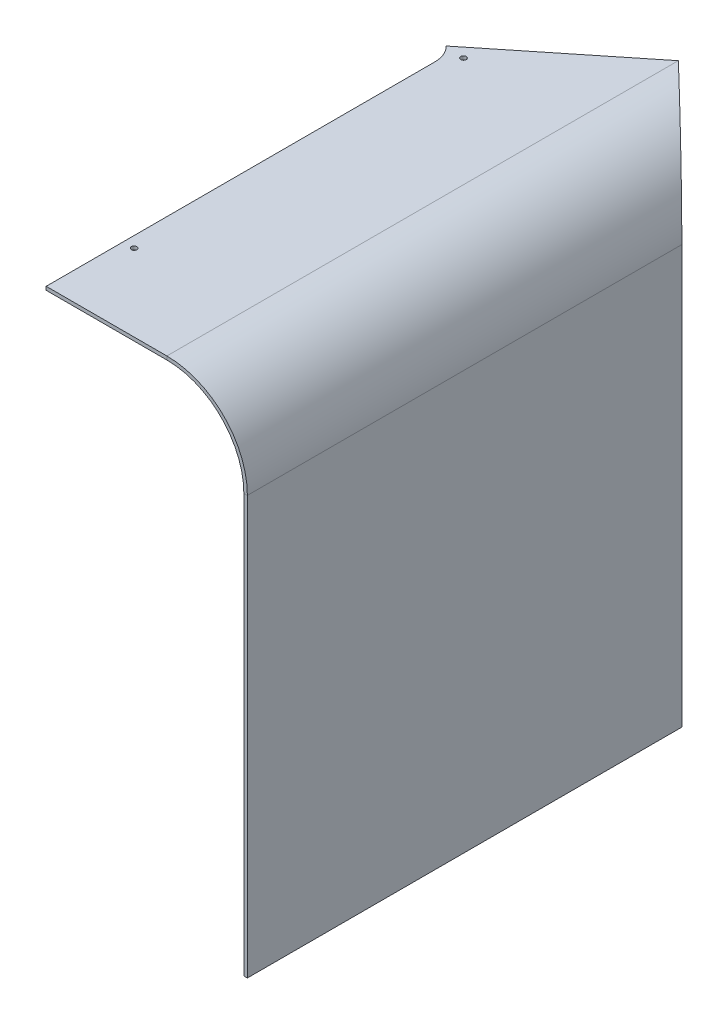
ISO-10303-21;
HEADER;
FILE_DESCRIPTION(('STEP AP214'),'2;1');
FILE_NAME('part.step','',(''),(''),'','','');
FILE_SCHEMA(('AUTOMOTIVE_DESIGN { 1 0 10303 214 1 1 1 1 }'));
ENDSEC;
DATA;
#1=APPLICATION_CONTEXT('core data for automotive mechanical design processes');
#2=APPLICATION_PROTOCOL_DEFINITION('international standard','automotive_design',2000,#1);
#3=PRODUCT_CONTEXT('',#1,'mechanical');
#4=PRODUCT('Part','Part','',(#3));
#5=PRODUCT_RELATED_PRODUCT_CATEGORY('part','',(#4));
#6=PRODUCT_DEFINITION_FORMATION('','',#4);
#7=PRODUCT_DEFINITION_CONTEXT('part definition',#1,'design');
#8=PRODUCT_DEFINITION('design','',#6,#7);
#9=PRODUCT_DEFINITION_SHAPE('','',#8);
#10=(LENGTH_UNIT() NAMED_UNIT(*) SI_UNIT(.MILLI.,.METRE.));
#11=(NAMED_UNIT(*) PLANE_ANGLE_UNIT() SI_UNIT($,.RADIAN.));
#12=(NAMED_UNIT(*) SI_UNIT($,.STERADIAN.) SOLID_ANGLE_UNIT());
#13=UNCERTAINTY_MEASURE_WITH_UNIT(LENGTH_MEASURE(1.E-05),#10,'distance_accuracy_value','');
#14=(GEOMETRIC_REPRESENTATION_CONTEXT(3) GLOBAL_UNCERTAINTY_ASSIGNED_CONTEXT((#13)) GLOBAL_UNIT_ASSIGNED_CONTEXT((#10,
#11,#12)) REPRESENTATION_CONTEXT('',''));
#15=CARTESIAN_POINT('',(0.,0.,0.));
#16=DIRECTION('',(0.,0.,1.));
#17=DIRECTION('',(1.,0.,0.));
#18=AXIS2_PLACEMENT_3D('',#15,#16,#17);
#19=CARTESIAN_POINT('',(255.,-0.01000000000001,-195.));
#20=DIRECTION('',(-0.625854842046578,0.,-0.779939559637061));
#21=DIRECTION('',(-0.779939559637061,0.,0.625854842046578));
#22=AXIS2_PLACEMENT_3D('',#19,#20,#21);
#23=PLANE('',#22);
#24=DIRECTION('',(0.,1.,0.));
#25=VECTOR('',#24,1.);
#26=CARTESIAN_POINT('',(255.,450.,-195.));
#27=LINE('',#26,#25);
#28=CARTESIAN_POINT('',(255.,450.,-195.));
#29=VERTEX_POINT('',#28);
#30=CARTESIAN_POINT('',(255.,453.2,-195.));
#31=VERTEX_POINT('',#30);
#32=EDGE_CURVE('E123',#29,#31,#27,.T.);
#33=ORIENTED_EDGE('',*,*,#32,.F.);
#34=DIRECTION('',(-0.779939559637061,0.,0.625854842046578));
#35=VECTOR('',#34,1.);
#36=CARTESIAN_POINT('',(-245.606205972282,450.,206.706534942418));
#37=LINE('',#36,#35);
#38=CARTESIAN_POINT('',(137.949402277664,450.,-101.073897081128));
#39=VERTEX_POINT('',#38);
#40=EDGE_CURVE('E114',#29,#39,#37,.T.);
#41=ORIENTED_EDGE('',*,*,#40,.T.);
#42=DIRECTION('',(0.,1.,0.));
#43=VECTOR('',#42,1.);
#44=CARTESIAN_POINT('',(137.949402277664,353.2,-101.073897081128));
#45=LINE('',#44,#43);
#46=CARTESIAN_POINT('',(137.949402277664,453.2,-101.073897081128));
#47=VERTEX_POINT('',#46);
#48=EDGE_CURVE('E122',#39,#47,#45,.T.);
#49=ORIENTED_EDGE('',*,*,#48,.T.);
#50=DIRECTION('',(-0.779939559637061,0.,0.625854842046578));
#51=VECTOR('',#50,1.);
#52=CARTESIAN_POINT('',(-245.606205972282,453.2,206.706534942418));
#53=LINE('',#52,#51);
#54=EDGE_CURVE('E124',#31,#47,#53,.T.);
#55=ORIENTED_EDGE('',*,*,#54,.F.);
#56=EDGE_LOOP('',(#33,#41,#49,#55));
#57=FACE_BOUND('',#56,.T.);
#58=ADVANCED_FACE('F39',(#57),#23,.T.);
#59=CARTESIAN_POINT('',(325.,0.,270.));
#60=DIRECTION('',(0.,0.,1.));
#61=DIRECTION('',(0.,-1.,0.));
#62=AXIS2_PLACEMENT_3D('',#59,#60,#61);
#63=PLANE('',#62);
#64=DIRECTION('',(1.,0.,0.));
#65=VECTOR('',#64,1.);
#66=CARTESIAN_POINT('',(325.,380.,269.999999999309));
#67=LINE('',#66,#65);
#68=CARTESIAN_POINT('',(325.,380.,269.999999999309));
#69=VERTEX_POINT('',#68);
#70=CARTESIAN_POINT('',(328.2,380.,269.999999999309));
#71=VERTEX_POINT('',#70);
#72=EDGE_CURVE('E210',#69,#71,#67,.T.);
#73=ORIENTED_EDGE('',*,*,#72,.F.);
#74=DIRECTION('',(0.,-1.,0.));
#75=VECTOR('',#74,1.);
#76=CARTESIAN_POINT('',(325.,0.,270.));
#77=LINE('',#76,#75);
#78=CARTESIAN_POINT('',(325.,0.,270.));
#79=VERTEX_POINT('',#78);
#80=EDGE_CURVE('E183',#69,#79,#77,.T.);
#81=ORIENTED_EDGE('',*,*,#80,.T.);
#82=DIRECTION('',(1.,0.,0.));
#83=VECTOR('',#82,1.);
#84=CARTESIAN_POINT('',(325.,0.,270.));
#85=LINE('',#84,#83);
#86=CARTESIAN_POINT('',(328.2,0.,270.));
#87=VERTEX_POINT('',#86);
#88=EDGE_CURVE('E212',#79,#87,#85,.T.);
#89=ORIENTED_EDGE('',*,*,#88,.T.);
#90=DIRECTION('',(0.,1.,0.));
#91=VECTOR('',#90,1.);
#92=CARTESIAN_POINT('',(328.2,450.,269.999999999309));
#93=LINE('',#92,#91);
#94=EDGE_CURVE('E150',#71,#87,#93,.F.);
#95=ORIENTED_EDGE('',*,*,#94,.F.);
#96=EDGE_LOOP('',(#73,#81,#89,#95));
#97=FACE_BOUND('',#96,.T.);
#98=ADVANCED_FACE('F235',(#97),#63,.T.);
#99=CARTESIAN_POINT('',(325.,0.,-265.));
#100=DIRECTION('',(0.,1.,0.));
#101=DIRECTION('',(0.,0.,1.));
#102=AXIS2_PLACEMENT_3D('',#99,#100,#101);
#103=PLANE('',#102);
#104=ORIENTED_EDGE('',*,*,#88,.F.);
#105=DIRECTION('',(0.,0.,1.));
#106=VECTOR('',#105,1.);
#107=CARTESIAN_POINT('',(325.,0.,-265.));
#108=LINE('',#107,#106);
#109=CARTESIAN_POINT('',(325.,8.88178419700125E-13,-125.));
#110=VERTEX_POINT('',#109);
#111=EDGE_CURVE('E145',#110,#79,#108,.T.);
#112=ORIENTED_EDGE('',*,*,#111,.F.);
#113=DIRECTION('',(1.,0.,0.));
#114=VECTOR('',#113,1.);
#115=CARTESIAN_POINT('',(325.,8.88178419700125E-13,-125.));
#116=LINE('',#115,#114);
#117=CARTESIAN_POINT('',(328.2,8.88178419700125E-13,-125.));
#118=VERTEX_POINT('',#117);
#119=EDGE_CURVE('E214',#110,#118,#116,.T.);
#120=ORIENTED_EDGE('',*,*,#119,.T.);
#121=DIRECTION('',(0.,0.,-1.));
#122=VECTOR('',#121,1.);
#123=CARTESIAN_POINT('',(328.2,8.88178419700125E-13,-265.));
#124=LINE('',#123,#122);
#125=EDGE_CURVE('E162',#118,#87,#124,.F.);
#126=ORIENTED_EDGE('',*,*,#125,.T.);
#127=EDGE_LOOP('',(#104,#112,#120,#126));
#128=FACE_BOUND('',#127,.T.);
#129=ADVANCED_FACE('F237',(#128),#103,.F.);
#130=CARTESIAN_POINT('',(328.2,450.,-265.));
#131=DIRECTION('',(1.,0.,0.));
#132=DIRECTION('',(0.,0.,-1.));
#133=AXIS2_PLACEMENT_3D('',#130,#131,#132);
#134=PLANE('',#133);
#135=ORIENTED_EDGE('',*,*,#125,.F.);
#136=DIRECTION('',(0.,1.,0.));
#137=VECTOR('',#136,1.);
#138=CARTESIAN_POINT('',(328.2,450.,-125.));
#139=LINE('',#138,#137);
#140=CARTESIAN_POINT('',(328.2,380.,-125.));
#141=VERTEX_POINT('',#140);
#142=EDGE_CURVE('E149',#141,#118,#139,.F.);
#143=ORIENTED_EDGE('',*,*,#142,.F.);
#144=DIRECTION('',(0.,0.,-1.));
#145=VECTOR('',#144,1.);
#146=CARTESIAN_POINT('',(328.2,380.,-265.));
#147=LINE('',#146,#145);
#148=EDGE_CURVE('E146',#141,#71,#147,.F.);
#149=ORIENTED_EDGE('',*,*,#148,.T.);
#150=ORIENTED_EDGE('',*,*,#94,.T.);
#151=EDGE_LOOP('',(#135,#143,#149,#150));
#152=FACE_BOUND('',#151,.T.);
#153=ADVANCED_FACE('F224',(#152),#134,.T.);
#154=CARTESIAN_POINT('',(255.,380.,269.999999998618));
#155=DIRECTION('',(0.,0.,-1.));
#156=DIRECTION('',(-1.,0.,0.));
#157=AXIS2_PLACEMENT_3D('',#154,#155,#156);
#158=PLANE('',#157);
#159=DIRECTION('',(0.,1.,0.));
#160=VECTOR('',#159,1.);
#161=CARTESIAN_POINT('',(255.,450.,269.999999999309));
#162=LINE('',#161,#160);
#163=CARTESIAN_POINT('',(255.,450.,269.999999999309));
#164=VERTEX_POINT('',#163);
#165=CARTESIAN_POINT('',(255.,453.2,269.999999999309));
#166=VERTEX_POINT('',#165);
#167=EDGE_CURVE('E207',#164,#166,#162,.T.);
#168=ORIENTED_EDGE('',*,*,#167,.F.);
#169=CARTESIAN_POINT('',(255.,380.,269.999999998618));
#170=DIRECTION('',(0.,0.,1.));
#171=DIRECTION('',(1.,0.,0.));
#172=AXIS2_PLACEMENT_3D('',#169,#170,#171);
#173=CIRCLE('',#172,70.);
#174=EDGE_CURVE('E166',#164,#69,#173,.F.);
#175=ORIENTED_EDGE('',*,*,#174,.T.);
#176=ORIENTED_EDGE('',*,*,#72,.T.);
#177=CARTESIAN_POINT('',(255.,380.,269.999999999309));
#178=DIRECTION('',(0.,0.,1.));
#179=DIRECTION('',(1.,0.,0.));
#180=AXIS2_PLACEMENT_3D('',#177,#178,#179);
#181=CIRCLE('',#180,73.2);
#182=EDGE_CURVE('E132',#166,#71,#181,.F.);
#183=ORIENTED_EDGE('',*,*,#182,.F.);
#184=EDGE_LOOP('',(#168,#175,#176,#183));
#185=FACE_BOUND('',#184,.T.);
#186=ADVANCED_FACE('F255',(#185),#158,.F.);
#187=CARTESIAN_POINT('',(325.,450.,-265.));
#188=DIRECTION('',(1.,0.,0.));
#189=DIRECTION('',(0.,0.,-1.));
#190=AXIS2_PLACEMENT_3D('',#187,#188,#189);
#191=PLANE('',#190);
#192=ORIENTED_EDGE('',*,*,#111,.T.);
#193=ORIENTED_EDGE('',*,*,#80,.F.);
#194=DIRECTION('',(0.,0.,1.));
#195=VECTOR('',#194,1.);
#196=CARTESIAN_POINT('',(325.,380.,-265.));
#197=LINE('',#196,#195);
#198=CARTESIAN_POINT('',(325.,380.,-125.));
#199=VERTEX_POINT('',#198);
#200=EDGE_CURVE('E180',#199,#69,#197,.T.);
#201=ORIENTED_EDGE('',*,*,#200,.F.);
#202=DIRECTION('',(0.,-1.,0.));
#203=VECTOR('',#202,1.);
#204=CARTESIAN_POINT('',(325.,2202.23473934319,-125.));
#205=LINE('',#204,#203);
#206=EDGE_CURVE('E176',#199,#110,#205,.T.);
#207=ORIENTED_EDGE('',*,*,#206,.T.);
#208=EDGE_LOOP('',(#192,#193,#201,#207));
#209=FACE_BOUND('',#208,.T.);
#210=ADVANCED_FACE('F240',(#209),#191,.F.);
#211=CARTESIAN_POINT('',(255.,380.,-265.));
#212=DIRECTION('',(0.,0.,1.));
#213=DIRECTION('',(1.,0.,0.));
#214=AXIS2_PLACEMENT_3D('',#211,#212,#213);
#215=CYLINDRICAL_SURFACE('',#214,70.);
#216=ORIENTED_EDGE('',*,*,#200,.T.);
#217=ORIENTED_EDGE('',*,*,#174,.F.);
#218=DIRECTION('',(0.,0.,1.));
#219=VECTOR('',#218,1.);
#220=CARTESIAN_POINT('',(255.,450.,195.));
#221=LINE('',#220,#219);
#222=EDGE_CURVE('E188',#164,#29,#221,.F.);
#223=ORIENTED_EDGE('',*,*,#222,.T.);
#224=CARTESIAN_POINT('',(255.,380.,-195.));
#225=DIRECTION('',(0.707106781186547,0.,-0.707106781186548));
#226=DIRECTION('',(0.707106781186548,0.,0.707106781186547));
#227=AXIS2_PLACEMENT_3D('',#224,#225,#226);
#228=ELLIPSE('',#227,98.9949493661166,70.);
#229=EDGE_CURVE('E190',#199,#29,#228,.F.);
#230=ORIENTED_EDGE('',*,*,#229,.F.);
#231=EDGE_LOOP('',(#216,#217,#223,#230));
#232=FACE_BOUND('',#231,.T.);
#233=ADVANCED_FACE('F245',(#232),#215,.F.);
#234=CARTESIAN_POINT('',(-255.,450.,195.));
#235=DIRECTION('',(0.,1.,0.));
#236=DIRECTION('',(0.,0.,1.));
#237=AXIS2_PLACEMENT_3D('',#234,#235,#236);
#238=PLANE('',#237);
#239=CARTESIAN_POINT('',(155.271732748,450.,-99.4606769681461));
#240=DIRECTION('',(0.,1.,0.));
#241=DIRECTION('',(0.,0.,1.));
#242=AXIS2_PLACEMENT_3D('',#239,#240,#241);
#243=CIRCLE('',#242,2.5);
#244=CARTESIAN_POINT('',(155.271732748,450.,-96.9606769681461));
#245=VERTEX_POINT('',#244);
#246=EDGE_CURVE('E135',#245,#245,#243,.T.);
#247=ORIENTED_EDGE('',*,*,#246,.T.);
#248=EDGE_LOOP('',(#247));
#249=FACE_BOUND('',#248,.T.);
#250=CARTESIAN_POINT('',(155.271732748,450.,200.));
#251=DIRECTION('',(0.,1.,0.));
#252=DIRECTION('',(0.,0.,1.));
#253=AXIS2_PLACEMENT_3D('',#250,#251,#252);
#254=CIRCLE('',#253,2.5);
#255=CARTESIAN_POINT('',(155.271732748,450.,202.5));
#256=VERTEX_POINT('',#255);
#257=EDGE_CURVE('E139',#256,#256,#254,.T.);
#258=ORIENTED_EDGE('',*,*,#257,.T.);
#259=EDGE_LOOP('',(#258));
#260=FACE_BOUND('',#259,.T.);
#261=ORIENTED_EDGE('',*,*,#40,.F.);
#262=ORIENTED_EDGE('',*,*,#222,.F.);
#263=DIRECTION('',(1.,0.,0.));
#264=VECTOR('',#263,1.);
#265=CARTESIAN_POINT('',(-255.,450.,270.));
#266=LINE('',#265,#264);
#267=CARTESIAN_POINT('',(145.271732748,450.,270.));
#268=VERTEX_POINT('',#267);
#269=EDGE_CURVE('E187',#268,#164,#266,.T.);
#270=ORIENTED_EDGE('',*,*,#269,.F.);
#271=DIRECTION('',(0.,0.,-1.));
#272=VECTOR('',#271,1.);
#273=CARTESIAN_POINT('',(145.271732748,450.,195.));
#274=LINE('',#273,#272);
#275=CARTESIAN_POINT('',(145.271732748,450.,-83.3962275514645));
#276=VERTEX_POINT('',#275);
#277=EDGE_CURVE('E117',#268,#276,#274,.T.);
#278=ORIENTED_EDGE('',*,*,#277,.T.);
#279=CARTESIAN_POINT('',(120.271732748,450.,-83.3962275514645));
#280=DIRECTION('',(0.,1.,0.));
#281=DIRECTION('',(0.,0.,1.));
#282=AXIS2_PLACEMENT_3D('',#279,#280,#281);
#283=CIRCLE('',#282,25.);
#284=EDGE_CURVE('E61',#276,#39,#283,.T.);
#285=ORIENTED_EDGE('',*,*,#284,.T.);
#286=EDGE_LOOP('',(#261,#262,#270,#278,#285));
#287=FACE_BOUND('',#286,.T.);
#288=ADVANCED_FACE('F112',(#249,#260,#287),#238,.F.);
#289=CARTESIAN_POINT('',(-255.,450.,270.));
#290=DIRECTION('',(0.,0.,1.));
#291=DIRECTION('',(1.,0.,0.));
#292=AXIS2_PLACEMENT_3D('',#289,#290,#291);
#293=PLANE('',#292);
#294=DIRECTION('',(1.,0.,0.));
#295=VECTOR('',#294,1.);
#296=CARTESIAN_POINT('',(-255.,453.2,270.));
#297=LINE('',#296,#295);
#298=CARTESIAN_POINT('',(145.271732748,453.2,270.));
#299=VERTEX_POINT('',#298);
#300=EDGE_CURVE('E154',#299,#166,#297,.T.);
#301=ORIENTED_EDGE('',*,*,#300,.F.);
#302=DIRECTION('',(0.,-1.,0.));
#303=VECTOR('',#302,1.);
#304=CARTESIAN_POINT('',(145.271732748,450.,270.));
#305=LINE('',#304,#303);
#306=EDGE_CURVE('E118',#299,#268,#305,.T.);
#307=ORIENTED_EDGE('',*,*,#306,.T.);
#308=ORIENTED_EDGE('',*,*,#269,.T.);
#309=ORIENTED_EDGE('',*,*,#167,.T.);
#310=EDGE_LOOP('',(#301,#307,#308,#309));
#311=FACE_BOUND('',#310,.T.);
#312=ADVANCED_FACE('F250',(#311),#293,.T.);
#313=CARTESIAN_POINT('',(145.271732748,353.2,-83.3962275514645));
#314=DIRECTION('',(1.,0.,0.));
#315=DIRECTION('',(0.,0.,-1.));
#316=AXIS2_PLACEMENT_3D('',#313,#314,#315);
#317=PLANE('',#316);
#318=ORIENTED_EDGE('',*,*,#277,.F.);
#319=ORIENTED_EDGE('',*,*,#306,.F.);
#320=DIRECTION('',(0.,0.,-1.));
#321=VECTOR('',#320,1.);
#322=CARTESIAN_POINT('',(145.271732748,453.2,-83.3962275514645));
#323=LINE('',#322,#321);
#324=CARTESIAN_POINT('',(145.271732748,453.2,-83.3962275514645));
#325=VERTEX_POINT('',#324);
#326=EDGE_CURVE('E142',#299,#325,#323,.T.);
#327=ORIENTED_EDGE('',*,*,#326,.T.);
#328=DIRECTION('',(0.,1.,0.));
#329=VECTOR('',#328,1.);
#330=CARTESIAN_POINT('',(145.271732748,353.2,-83.3962275514645));
#331=LINE('',#330,#329);
#332=EDGE_CURVE('E56',#276,#325,#331,.T.);
#333=ORIENTED_EDGE('',*,*,#332,.F.);
#334=EDGE_LOOP('',(#318,#319,#327,#333));
#335=FACE_BOUND('',#334,.T.);
#336=ADVANCED_FACE('F252',(#335),#317,.F.);
#337=CARTESIAN_POINT('',(120.271732748,353.2,-83.3962275514645));
#338=DIRECTION('',(0.,1.,0.));
#339=DIRECTION('',(0.,0.,1.));
#340=AXIS2_PLACEMENT_3D('',#337,#338,#339);
#341=CYLINDRICAL_SURFACE('',#340,25.);
#342=ORIENTED_EDGE('',*,*,#48,.F.);
#343=ORIENTED_EDGE('',*,*,#284,.F.);
#344=ORIENTED_EDGE('',*,*,#332,.T.);
#345=CARTESIAN_POINT('',(120.271732748,453.2,-83.3962275514645));
#346=DIRECTION('',(0.,1.,0.));
#347=DIRECTION('',(0.,0.,-1.));
#348=AXIS2_PLACEMENT_3D('',#345,#346,#347);
#349=CIRCLE('',#348,25.);
#350=EDGE_CURVE('E43',#325,#47,#349,.T.);
#351=ORIENTED_EDGE('',*,*,#350,.T.);
#352=EDGE_LOOP('',(#342,#343,#344,#351));
#353=FACE_BOUND('',#352,.T.);
#354=ADVANCED_FACE('F126',(#353),#341,.F.);
#355=CARTESIAN_POINT('',(255.,380.,-265.));
#356=DIRECTION('',(0.,0.,1.));
#357=DIRECTION('',(1.,0.,0.));
#358=AXIS2_PLACEMENT_3D('',#355,#356,#357);
#359=CYLINDRICAL_SURFACE('',#358,73.2);
#360=ORIENTED_EDGE('',*,*,#148,.F.);
#361=CARTESIAN_POINT('',(255.,380.,-195.));
#362=DIRECTION('',(0.691132971722828,0.,-0.722727621858728));
#363=DIRECTION('',(0.722727621858728,0.,0.691132971722828));
#364=AXIS2_PLACEMENT_3D('',#361,#362,#363);
#365=ELLIPSE('',#364,101.282969940657,73.2);
#366=EDGE_CURVE('E155',#141,#31,#365,.F.);
#367=ORIENTED_EDGE('',*,*,#366,.T.);
#368=DIRECTION('',(0.,0.,1.));
#369=VECTOR('',#368,1.);
#370=CARTESIAN_POINT('',(255.,453.2,195.));
#371=LINE('',#370,#369);
#372=EDGE_CURVE('E151',#166,#31,#371,.F.);
#373=ORIENTED_EDGE('',*,*,#372,.F.);
#374=ORIENTED_EDGE('',*,*,#182,.T.);
#375=EDGE_LOOP('',(#360,#367,#373,#374));
#376=FACE_BOUND('',#375,.T.);
#377=ADVANCED_FACE('F229',(#376),#359,.T.);
#378=CARTESIAN_POINT('',(155.271732748,423.2,200.));
#379=DIRECTION('',(0.,1.,0.));
#380=DIRECTION('',(0.,0.,1.));
#381=AXIS2_PLACEMENT_3D('',#378,#379,#380);
#382=CYLINDRICAL_SURFACE('',#381,2.5);
#383=CARTESIAN_POINT('',(155.271732748,453.2,200.));
#384=DIRECTION('',(0.,1.,0.));
#385=DIRECTION('',(0.,0.,1.));
#386=AXIS2_PLACEMENT_3D('',#383,#384,#385);
#387=CIRCLE('',#386,2.5);
#388=CARTESIAN_POINT('',(155.271732748,453.2,202.5));
#389=VERTEX_POINT('',#388);
#390=EDGE_CURVE('E48',#389,#389,#387,.T.);
#391=ORIENTED_EDGE('',*,*,#390,.T.);
#392=EDGE_LOOP('',(#391));
#393=FACE_BOUND('',#392,.T.);
#394=ORIENTED_EDGE('',*,*,#257,.F.);
#395=EDGE_LOOP('',(#394));
#396=FACE_BOUND('',#395,.T.);
#397=ADVANCED_FACE('F289',(#393,#396),#382,.F.);
#398=CARTESIAN_POINT('',(155.271732748,423.2,-99.4606769681461));
#399=DIRECTION('',(0.,1.,0.));
#400=DIRECTION('',(0.,0.,1.));
#401=AXIS2_PLACEMENT_3D('',#398,#399,#400);
#402=CYLINDRICAL_SURFACE('',#401,2.5);
#403=CARTESIAN_POINT('',(155.271732748,453.2,-99.4606769681461));
#404=DIRECTION('',(0.,1.,0.));
#405=DIRECTION('',(0.,0.,1.));
#406=AXIS2_PLACEMENT_3D('',#403,#404,#405);
#407=CIRCLE('',#406,2.5);
#408=CARTESIAN_POINT('',(155.271732748,453.2,-96.9606769681461));
#409=VERTEX_POINT('',#408);
#410=EDGE_CURVE('E11',#409,#409,#407,.T.);
#411=ORIENTED_EDGE('',*,*,#410,.T.);
#412=EDGE_LOOP('',(#411));
#413=FACE_BOUND('',#412,.T.);
#414=ORIENTED_EDGE('',*,*,#246,.F.);
#415=EDGE_LOOP('',(#414));
#416=FACE_BOUND('',#415,.T.);
#417=ADVANCED_FACE('F292',(#413,#416),#402,.F.);
#418=CARTESIAN_POINT('',(-255.,453.2,195.));
#419=DIRECTION('',(0.,1.,0.));
#420=DIRECTION('',(0.,0.,1.));
#421=AXIS2_PLACEMENT_3D('',#418,#419,#420);
#422=PLANE('',#421);
#423=ORIENTED_EDGE('',*,*,#410,.F.);
#424=EDGE_LOOP('',(#423));
#425=FACE_BOUND('',#424,.T.);
#426=ORIENTED_EDGE('',*,*,#390,.F.);
#427=EDGE_LOOP('',(#426));
#428=FACE_BOUND('',#427,.T.);
#429=ORIENTED_EDGE('',*,*,#372,.T.);
#430=ORIENTED_EDGE('',*,*,#54,.T.);
#431=ORIENTED_EDGE('',*,*,#350,.F.);
#432=ORIENTED_EDGE('',*,*,#326,.F.);
#433=ORIENTED_EDGE('',*,*,#300,.T.);
#434=EDGE_LOOP('',(#429,#430,#431,#432,#433));
#435=FACE_BOUND('',#434,.T.);
#436=ADVANCED_FACE('F41',(#425,#428,#435),#422,.T.);
#437=CARTESIAN_POINT('',(325.,2202.23473934319,-125.));
#438=DIRECTION('',(0.,0.,1.));
#439=DIRECTION('',(0.,-1.,0.));
#440=AXIS2_PLACEMENT_3D('',#437,#438,#439);
#441=PLANE('',#440);
#442=ORIENTED_EDGE('',*,*,#119,.F.);
#443=ORIENTED_EDGE('',*,*,#206,.F.);
#444=DIRECTION('',(1.,0.,0.));
#445=VECTOR('',#444,1.);
#446=CARTESIAN_POINT('',(325.,380.,-125.));
#447=LINE('',#446,#445);
#448=EDGE_CURVE('E133',#199,#141,#447,.T.);
#449=ORIENTED_EDGE('',*,*,#448,.T.);
#450=ORIENTED_EDGE('',*,*,#142,.T.);
#451=EDGE_LOOP('',(#442,#443,#449,#450));
#452=FACE_BOUND('',#451,.T.);
#453=ADVANCED_FACE('F218',(#452),#441,.F.);
#454=CARTESIAN_POINT('',(328.2,380.,-125.));
#455=CARTESIAN_POINT('',(327.133333333333,380.,-125.));
#456=CARTESIAN_POINT('',(326.066666666666,380.,-125.));
#457=CARTESIAN_POINT('',(325.,380.,-125.));
#458=CARTESIAN_POINT('',(328.2,526.4,-125.));
#459=CARTESIAN_POINT('',(327.133333333333,524.266666666667,-125.));
#460=CARTESIAN_POINT('',(326.066666666667,522.133333333334,-125.));
#461=CARTESIAN_POINT('',(325.,520.,-125.));
#462=CARTESIAN_POINT('',(181.8,526.4,-265.));
#463=CARTESIAN_POINT('',(182.866666666667,524.266666666667,-265.));
#464=CARTESIAN_POINT('',(183.933333333333,522.133333333334,-265.));
#465=CARTESIAN_POINT('',(185.,520.,-265.));
#466=CARTESIAN_POINT('',(181.8,380.,-265.));
#467=CARTESIAN_POINT('',(182.866666666667,380.,-265.));
#468=CARTESIAN_POINT('',(183.933333333333,380.,-265.));
#469=CARTESIAN_POINT('',(185.,380.,-265.));
#470=CARTESIAN_POINT('',(181.8,233.6,-265.));
#471=CARTESIAN_POINT('',(182.866666666667,235.733333333333,-265.));
#472=CARTESIAN_POINT('',(183.933333333333,237.866666666667,-265.));
#473=CARTESIAN_POINT('',(185.,240.,-265.));
#474=CARTESIAN_POINT('',(328.2,233.6,-125.));
#475=CARTESIAN_POINT('',(327.133333333333,235.733333333333,-125.));
#476=CARTESIAN_POINT('',(326.066666666667,237.866666666667,-125.));
#477=CARTESIAN_POINT('',(325.,240.,-125.));
#478=CARTESIAN_POINT('',(328.2,380.,-125.));
#479=CARTESIAN_POINT('',(327.133333333333,380.,-125.));
#480=CARTESIAN_POINT('',(326.066666666666,380.,-125.));
#481=CARTESIAN_POINT('',(325.,380.,-125.));
#482=(BOUNDED_SURFACE() B_SPLINE_SURFACE(3,3,((#454,#455,#456,#457),(#458,#459,#460,#461),(#462,
#463,#464,#465),(#466,#467,#468,#469),(#470,#471,#472,#473),(#474,#475,#476,#477),(#478,#479,
#480,#481)),.UNSPECIFIED.,.T.,.F.,.F.) B_SPLINE_SURFACE_WITH_KNOTS((4,3,4),(4,4),(0.,0.5,1.),
(0.,1.),.UNSPECIFIED.) GEOMETRIC_REPRESENTATION_ITEM() RATIONAL_B_SPLINE_SURFACE(((1.,1.,1.,1.),
(0.333333333333333,0.333333333333333,0.333333333333333,0.333333333333333),(0.333333333333333,
0.333333333333333,0.333333333333333,0.333333333333333),(1.,1.,1.,1.),(0.333333333333333,
0.333333333333333,0.333333333333333,0.333333333333333),(0.333333333333333,0.333333333333333,
0.333333333333333,0.333333333333333),(1.,1.,1.,1.))) REPRESENTATION_ITEM('') SURFACE());
#483=ORIENTED_EDGE('',*,*,#448,.F.);
#484=ORIENTED_EDGE('',*,*,#229,.T.);
#485=ORIENTED_EDGE('',*,*,#32,.T.);
#486=ORIENTED_EDGE('',*,*,#366,.F.);
#487=EDGE_LOOP('',(#483,#484,#485,#486));
#488=FACE_BOUND('',#487,.T.);
#489=ADVANCED_FACE('F226',(#488),#482,.F.);
#490=CLOSED_SHELL('',(#58,#98,#129,#153,#186,#210,#233,#288,#312,#336,#354,#377,#397,#417,#436,
#453,#489));
#491=MANIFOLD_SOLID_BREP('B2',#490);
#492=ADVANCED_BREP_SHAPE_REPRESENTATION('',(#18,#491),#14);
#493=SHAPE_DEFINITION_REPRESENTATION(#9,#492);
ENDSEC;
END-ISO-10303-21;
